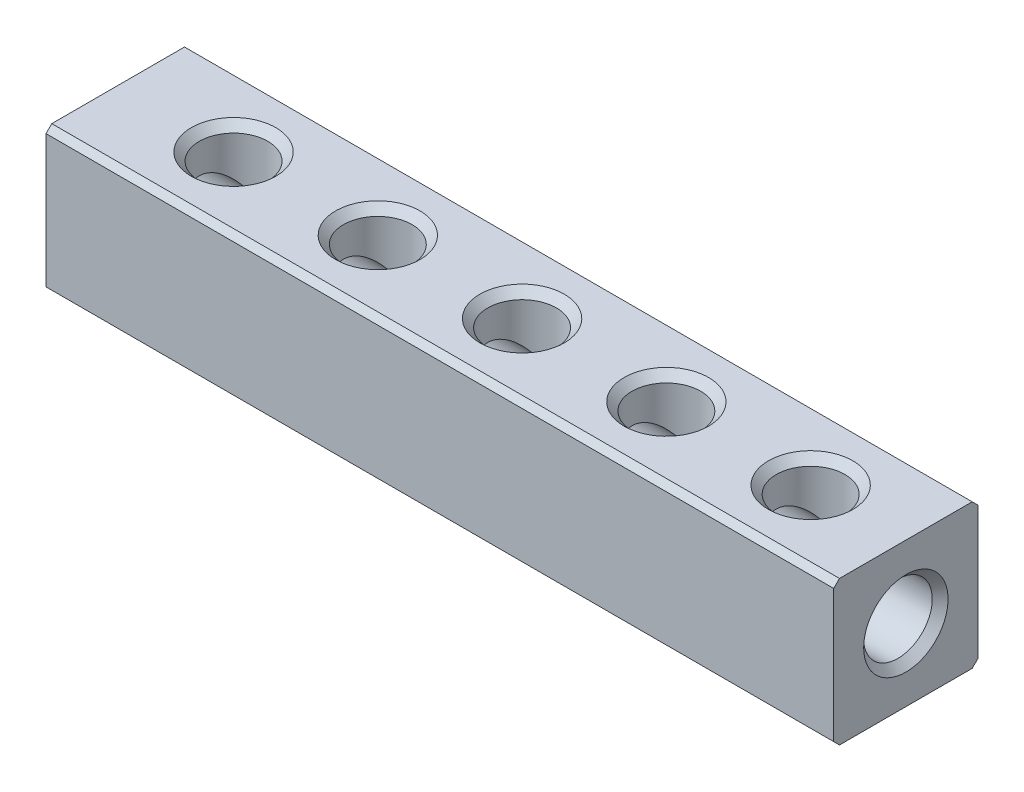
ISO-10303-21;
HEADER;
FILE_DESCRIPTION(('STEP AP214'),'2;1');
FILE_NAME('part.step','',(''),(''),'','','');
FILE_SCHEMA(('AUTOMOTIVE_DESIGN { 1 0 10303 214 1 1 1 1 }'));
ENDSEC;
DATA;
#1=APPLICATION_CONTEXT('core data for automotive mechanical design processes');
#2=APPLICATION_PROTOCOL_DEFINITION('international standard','automotive_design',2000,#1);
#3=PRODUCT_CONTEXT('',#1,'mechanical');
#4=PRODUCT('Part','Part','',(#3));
#5=PRODUCT_RELATED_PRODUCT_CATEGORY('part','',(#4));
#6=PRODUCT_DEFINITION_FORMATION('','',#4);
#7=PRODUCT_DEFINITION_CONTEXT('part definition',#1,'design');
#8=PRODUCT_DEFINITION('design','',#6,#7);
#9=PRODUCT_DEFINITION_SHAPE('','',#8);
#10=(LENGTH_UNIT() NAMED_UNIT(*) SI_UNIT(.MILLI.,.METRE.));
#11=(NAMED_UNIT(*) PLANE_ANGLE_UNIT() SI_UNIT($,.RADIAN.));
#12=(NAMED_UNIT(*) SI_UNIT($,.STERADIAN.) SOLID_ANGLE_UNIT());
#13=UNCERTAINTY_MEASURE_WITH_UNIT(LENGTH_MEASURE(1.E-05),#10,'distance_accuracy_value','');
#14=(GEOMETRIC_REPRESENTATION_CONTEXT(3) GLOBAL_UNCERTAINTY_ASSIGNED_CONTEXT((#13)) GLOBAL_UNIT_ASSIGNED_CONTEXT((#10,
#11,#12)) REPRESENTATION_CONTEXT('',''));
#15=CARTESIAN_POINT('',(0.,0.,0.));
#16=DIRECTION('',(0.,0.,1.));
#17=DIRECTION('',(1.,0.,0.));
#18=AXIS2_PLACEMENT_3D('',#15,#16,#17);
#19=CARTESIAN_POINT('',(0.,0.,25.));
#20=DIRECTION('',(0.,-1.,0.));
#21=DIRECTION('',(0.,0.,-1.));
#22=AXIS2_PLACEMENT_3D('',#19,#20,#21);
#23=PLANE('',#22);
#24=CARTESIAN_POINT('',(70.,0.,12.5));
#25=DIRECTION('',(0.,1.,0.));
#26=DIRECTION('',(0.,0.,1.));
#27=AXIS2_PLACEMENT_3D('',#24,#25,#26);
#28=CIRCLE('',#27,7.31519999999999);
#29=CARTESIAN_POINT('',(70.,0.,19.8152));
#30=VERTEX_POINT('',#29);
#31=EDGE_CURVE('E308',#30,#30,#28,.T.);
#32=ORIENTED_EDGE('',*,*,#31,.F.);
#33=EDGE_LOOP('',(#32));
#34=FACE_BOUND('',#33,.T.);
#35=DIRECTION('',(0.,0.,-1.));
#36=VECTOR('',#35,1.);
#37=CARTESIAN_POINT('',(136.5,0.,25.));
#38=LINE('',#37,#36);
#39=CARTESIAN_POINT('',(136.5,0.,24.));
#40=VERTEX_POINT('',#39);
#41=CARTESIAN_POINT('',(136.5,0.,1.));
#42=VERTEX_POINT('',#41);
#43=EDGE_CURVE('E248',#40,#42,#38,.T.);
#44=ORIENTED_EDGE('',*,*,#43,.T.);
#45=DIRECTION('',(-1.,0.,0.));
#46=VECTOR('',#45,1.);
#47=CARTESIAN_POINT('',(0.,0.,1.));
#48=LINE('',#47,#46);
#49=CARTESIAN_POINT('',(0.,0.,1.));
#50=VERTEX_POINT('',#49);
#51=EDGE_CURVE('E170',#42,#50,#48,.T.);
#52=ORIENTED_EDGE('',*,*,#51,.T.);
#53=DIRECTION('',(0.,0.,-1.));
#54=VECTOR('',#53,1.);
#55=CARTESIAN_POINT('',(0.,0.,25.));
#56=LINE('',#55,#54);
#57=CARTESIAN_POINT('',(0.,0.,24.));
#58=VERTEX_POINT('',#57);
#59=EDGE_CURVE('E234',#58,#50,#56,.T.);
#60=ORIENTED_EDGE('',*,*,#59,.F.);
#61=DIRECTION('',(1.,0.,0.));
#62=VECTOR('',#61,1.);
#63=CARTESIAN_POINT('',(136.5,0.,24.));
#64=LINE('',#63,#62);
#65=EDGE_CURVE('E167',#58,#40,#64,.T.);
#66=ORIENTED_EDGE('',*,*,#65,.T.);
#67=EDGE_LOOP('',(#44,#52,#60,#66));
#68=FACE_BOUND('',#67,.T.);
#69=CARTESIAN_POINT('',(20.,0.,12.5));
#70=DIRECTION('',(0.,1.,0.));
#71=DIRECTION('',(0.,0.,1.));
#72=AXIS2_PLACEMENT_3D('',#69,#70,#71);
#73=CIRCLE('',#72,7.3152);
#74=CARTESIAN_POINT('',(20.,0.,19.8152));
#75=VERTEX_POINT('',#74);
#76=EDGE_CURVE('E332',#75,#75,#73,.T.);
#77=ORIENTED_EDGE('',*,*,#76,.F.);
#78=EDGE_LOOP('',(#77));
#79=FACE_BOUND('',#78,.T.);
#80=CARTESIAN_POINT('',(45.,0.,12.5));
#81=DIRECTION('',(0.,1.,0.));
#82=DIRECTION('',(0.,0.,1.));
#83=AXIS2_PLACEMENT_3D('',#80,#81,#82);
#84=CIRCLE('',#83,7.3152);
#85=CARTESIAN_POINT('',(45.,0.,19.8152));
#86=VERTEX_POINT('',#85);
#87=EDGE_CURVE('E323',#86,#86,#84,.T.);
#88=ORIENTED_EDGE('',*,*,#87,.F.);
#89=EDGE_LOOP('',(#88));
#90=FACE_BOUND('',#89,.T.);
#91=CARTESIAN_POINT('',(95.,0.,12.5));
#92=DIRECTION('',(0.,1.,0.));
#93=DIRECTION('',(0.,0.,1.));
#94=AXIS2_PLACEMENT_3D('',#91,#92,#93);
#95=CIRCLE('',#94,7.31519999999999);
#96=CARTESIAN_POINT('',(95.,0.,19.8152));
#97=VERTEX_POINT('',#96);
#98=EDGE_CURVE('E309',#97,#97,#95,.T.);
#99=ORIENTED_EDGE('',*,*,#98,.F.);
#100=EDGE_LOOP('',(#99));
#101=FACE_BOUND('',#100,.T.);
#102=CARTESIAN_POINT('',(120.,0.,12.5));
#103=DIRECTION('',(0.,1.,0.));
#104=DIRECTION('',(0.,0.,1.));
#105=AXIS2_PLACEMENT_3D('',#102,#103,#104);
#106=CIRCLE('',#105,7.31520000000001);
#107=CARTESIAN_POINT('',(120.,0.,19.8152));
#108=VERTEX_POINT('',#107);
#109=EDGE_CURVE('E397',#108,#108,#106,.T.);
#110=ORIENTED_EDGE('',*,*,#109,.F.);
#111=EDGE_LOOP('',(#110));
#112=FACE_BOUND('',#111,.T.);
#113=ADVANCED_FACE('F51',(#34,#68,#79,#90,#101,#112),#23,.F.);
#114=CARTESIAN_POINT('',(0.,-25.,25.));
#115=DIRECTION('',(0.,1.,0.));
#116=DIRECTION('',(0.,0.,1.));
#117=AXIS2_PLACEMENT_3D('',#114,#115,#116);
#118=PLANE('',#117);
#119=DIRECTION('',(0.,0.,-1.));
#120=VECTOR('',#119,1.);
#121=CARTESIAN_POINT('',(0.,-25.,25.));
#122=LINE('',#121,#120);
#123=CARTESIAN_POINT('',(0.,-25.,24.));
#124=VERTEX_POINT('',#123);
#125=CARTESIAN_POINT('',(0.,-25.,0.999999999999973));
#126=VERTEX_POINT('',#125);
#127=EDGE_CURVE('E255',#124,#126,#122,.T.);
#128=ORIENTED_EDGE('',*,*,#127,.T.);
#129=DIRECTION('',(1.,0.,0.));
#130=VECTOR('',#129,1.);
#131=CARTESIAN_POINT('',(0.,-25.,0.999999999999973));
#132=LINE('',#131,#130);
#133=CARTESIAN_POINT('',(136.5,-25.,0.999999999999973));
#134=VERTEX_POINT('',#133);
#135=EDGE_CURVE('E208',#126,#134,#132,.T.);
#136=ORIENTED_EDGE('',*,*,#135,.T.);
#137=DIRECTION('',(0.,0.,-1.));
#138=VECTOR('',#137,1.);
#139=CARTESIAN_POINT('',(136.5,-25.,25.));
#140=LINE('',#139,#138);
#141=CARTESIAN_POINT('',(136.5,-25.,24.));
#142=VERTEX_POINT('',#141);
#143=EDGE_CURVE('E252',#142,#134,#140,.T.);
#144=ORIENTED_EDGE('',*,*,#143,.F.);
#145=DIRECTION('',(-1.,0.,0.));
#146=VECTOR('',#145,1.);
#147=CARTESIAN_POINT('',(0.,-25.,24.));
#148=LINE('',#147,#146);
#149=EDGE_CURVE('E205',#142,#124,#148,.T.);
#150=ORIENTED_EDGE('',*,*,#149,.T.);
#151=EDGE_LOOP('',(#128,#136,#144,#150));
#152=FACE_BOUND('',#151,.T.);
#153=CARTESIAN_POINT('',(68.25,-25.,12.5));
#154=DIRECTION('',(0.,-1.,0.));
#155=DIRECTION('',(0.,0.,-1.));
#156=AXIS2_PLACEMENT_3D('',#153,#154,#155);
#157=CIRCLE('',#156,7.31519999999999);
#158=CARTESIAN_POINT('',(68.25,-25.,5.18480000000001));
#159=VERTEX_POINT('',#158);
#160=EDGE_CURVE('E340',#159,#159,#157,.T.);
#161=ORIENTED_EDGE('',*,*,#160,.F.);
#162=EDGE_LOOP('',(#161));
#163=FACE_BOUND('',#162,.T.);
#164=ADVANCED_FACE('F390',(#152,#163),#118,.F.);
#165=CARTESIAN_POINT('',(0.,0.,25.));
#166=DIRECTION('',(1.,0.,0.));
#167=DIRECTION('',(0.,1.,0.));
#168=AXIS2_PLACEMENT_3D('',#165,#166,#167);
#169=PLANE('',#168);
#170=CARTESIAN_POINT('',(0.,-12.5,12.5));
#171=DIRECTION('',(-1.,0.,0.));
#172=DIRECTION('',(0.,0.,1.));
#173=AXIS2_PLACEMENT_3D('',#170,#171,#172);
#174=CIRCLE('',#173,7.3152);
#175=CARTESIAN_POINT('',(0.,-12.5,19.8152));
#176=VERTEX_POINT('',#175);
#177=EDGE_CURVE('E352',#176,#176,#174,.T.);
#178=ORIENTED_EDGE('',*,*,#177,.F.);
#179=EDGE_LOOP('',(#178));
#180=FACE_BOUND('',#179,.T.);
#181=ORIENTED_EDGE('',*,*,#59,.T.);
#182=DIRECTION('',(0.,0.707106781186548,0.707106781186548));
#183=VECTOR('',#182,1.);
#184=CARTESIAN_POINT('',(0.,0.,1.));
#185=LINE('',#184,#183);
#186=CARTESIAN_POINT('',(0.,-1.,0.));
#187=VERTEX_POINT('',#186);
#188=EDGE_CURVE('E186',#50,#187,#185,.F.);
#189=ORIENTED_EDGE('',*,*,#188,.T.);
#190=DIRECTION('',(0.,-1.,0.));
#191=VECTOR('',#190,1.);
#192=CARTESIAN_POINT('',(0.,0.,0.));
#193=LINE('',#192,#191);
#194=CARTESIAN_POINT('',(0.,-24.,0.));
#195=VERTEX_POINT('',#194);
#196=EDGE_CURVE('E237',#187,#195,#193,.T.);
#197=ORIENTED_EDGE('',*,*,#196,.T.);
#198=DIRECTION('',(0.,0.707106781186552,-0.707106781186543));
#199=VECTOR('',#198,1.);
#200=CARTESIAN_POINT('',(0.,-25.,0.999999999999973));
#201=LINE('',#200,#199);
#202=EDGE_CURVE('E183',#195,#126,#201,.F.);
#203=ORIENTED_EDGE('',*,*,#202,.T.);
#204=ORIENTED_EDGE('',*,*,#127,.F.);
#205=DIRECTION('',(0.,0.707106781186543,0.707106781186552));
#206=VECTOR('',#205,1.);
#207=CARTESIAN_POINT('',(0.,-24.,25.));
#208=LINE('',#207,#206);
#209=CARTESIAN_POINT('',(0.,-24.,25.));
#210=VERTEX_POINT('',#209);
#211=EDGE_CURVE('E180',#124,#210,#208,.T.);
#212=ORIENTED_EDGE('',*,*,#211,.T.);
#213=DIRECTION('',(0.,-1.,0.));
#214=VECTOR('',#213,1.);
#215=CARTESIAN_POINT('',(0.,0.,25.));
#216=LINE('',#215,#214);
#217=CARTESIAN_POINT('',(0.,-0.999999999999973,25.));
#218=VERTEX_POINT('',#217);
#219=EDGE_CURVE('E218',#218,#210,#216,.T.);
#220=ORIENTED_EDGE('',*,*,#219,.F.);
#221=DIRECTION('',(0.,0.707106781186543,-0.707106781186552));
#222=VECTOR('',#221,1.);
#223=CARTESIAN_POINT('',(0.,-0.999999999999973,25.));
#224=LINE('',#223,#222);
#225=EDGE_CURVE('E177',#218,#58,#224,.T.);
#226=ORIENTED_EDGE('',*,*,#225,.T.);
#227=EDGE_LOOP('',(#181,#189,#197,#203,#204,#212,#220,#226));
#228=FACE_BOUND('',#227,.T.);
#229=ADVANCED_FACE('F225',(#180,#228),#169,.F.);
#230=CARTESIAN_POINT('',(136.5,0.,25.));
#231=DIRECTION('',(-1.,0.,0.));
#232=DIRECTION('',(0.,0.,1.));
#233=AXIS2_PLACEMENT_3D('',#230,#231,#232);
#234=PLANE('',#233);
#235=CARTESIAN_POINT('',(136.5,-12.5,12.5));
#236=DIRECTION('',(-1.,0.,0.));
#237=DIRECTION('',(0.,0.,1.));
#238=AXIS2_PLACEMENT_3D('',#235,#236,#237);
#239=CIRCLE('',#238,7.31519999999997);
#240=CARTESIAN_POINT('',(136.5,-12.5,19.8152));
#241=VERTEX_POINT('',#240);
#242=EDGE_CURVE('E348',#241,#241,#239,.T.);
#243=ORIENTED_EDGE('',*,*,#242,.T.);
#244=EDGE_LOOP('',(#243));
#245=FACE_BOUND('',#244,.T.);
#246=DIRECTION('',(0.,1.,0.));
#247=VECTOR('',#246,1.);
#248=CARTESIAN_POINT('',(136.5,0.,0.));
#249=LINE('',#248,#247);
#250=CARTESIAN_POINT('',(136.5,-24.,0.));
#251=VERTEX_POINT('',#250);
#252=CARTESIAN_POINT('',(136.5,-1.,0.));
#253=VERTEX_POINT('',#252);
#254=EDGE_CURVE('E230',#251,#253,#249,.T.);
#255=ORIENTED_EDGE('',*,*,#254,.T.);
#256=DIRECTION('',(0.,-0.707106781186548,-0.707106781186548));
#257=VECTOR('',#256,1.);
#258=CARTESIAN_POINT('',(136.5,0.,1.));
#259=LINE('',#258,#257);
#260=EDGE_CURVE('E202',#253,#42,#259,.F.);
#261=ORIENTED_EDGE('',*,*,#260,.T.);
#262=ORIENTED_EDGE('',*,*,#43,.F.);
#263=DIRECTION('',(0.,-0.707106781186543,0.707106781186552));
#264=VECTOR('',#263,1.);
#265=CARTESIAN_POINT('',(136.5,-0.999999999999973,25.));
#266=LINE('',#265,#264);
#267=CARTESIAN_POINT('',(136.5,-0.999999999999973,25.));
#268=VERTEX_POINT('',#267);
#269=EDGE_CURVE('E195',#40,#268,#266,.T.);
#270=ORIENTED_EDGE('',*,*,#269,.T.);
#271=DIRECTION('',(0.,1.,0.));
#272=VECTOR('',#271,1.);
#273=CARTESIAN_POINT('',(136.5,0.,25.));
#274=LINE('',#273,#272);
#275=CARTESIAN_POINT('',(136.5,-24.,25.));
#276=VERTEX_POINT('',#275);
#277=EDGE_CURVE('E220',#276,#268,#274,.T.);
#278=ORIENTED_EDGE('',*,*,#277,.F.);
#279=DIRECTION('',(0.,-0.707106781186543,-0.707106781186552));
#280=VECTOR('',#279,1.);
#281=CARTESIAN_POINT('',(136.5,-24.,25.));
#282=LINE('',#281,#280);
#283=EDGE_CURVE('E76',#276,#142,#282,.T.);
#284=ORIENTED_EDGE('',*,*,#283,.T.);
#285=ORIENTED_EDGE('',*,*,#143,.T.);
#286=DIRECTION('',(0.,-0.707106781186552,0.707106781186543));
#287=VECTOR('',#286,1.);
#288=CARTESIAN_POINT('',(136.5,-25.,0.999999999999973));
#289=LINE('',#288,#287);
#290=EDGE_CURVE('E68',#134,#251,#289,.F.);
#291=ORIENTED_EDGE('',*,*,#290,.T.);
#292=EDGE_LOOP('',(#255,#261,#262,#270,#278,#284,#285,#291));
#293=FACE_BOUND('',#292,.T.);
#294=ADVANCED_FACE('F451',(#245,#293),#234,.F.);
#295=CARTESIAN_POINT('',(0.,0.,25.));
#296=DIRECTION('',(0.,0.,1.));
#297=DIRECTION('',(1.,0.,0.));
#298=AXIS2_PLACEMENT_3D('',#295,#296,#297);
#299=PLANE('',#298);
#300=ORIENTED_EDGE('',*,*,#219,.T.);
#301=DIRECTION('',(1.,0.,0.));
#302=VECTOR('',#301,1.);
#303=CARTESIAN_POINT('',(136.5,-24.,25.));
#304=LINE('',#303,#302);
#305=EDGE_CURVE('E11',#210,#276,#304,.T.);
#306=ORIENTED_EDGE('',*,*,#305,.T.);
#307=ORIENTED_EDGE('',*,*,#277,.T.);
#308=DIRECTION('',(-1.,0.,0.));
#309=VECTOR('',#308,1.);
#310=CARTESIAN_POINT('',(0.,-0.999999999999973,25.));
#311=LINE('',#310,#309);
#312=EDGE_CURVE('E61',#268,#218,#311,.T.);
#313=ORIENTED_EDGE('',*,*,#312,.T.);
#314=EDGE_LOOP('',(#300,#306,#307,#313));
#315=FACE_BOUND('',#314,.T.);
#316=ADVANCED_FACE('F217',(#315),#299,.T.);
#317=CARTESIAN_POINT('',(0.,0.,0.));
#318=DIRECTION('',(0.,0.,1.));
#319=DIRECTION('',(1.,0.,0.));
#320=AXIS2_PLACEMENT_3D('',#317,#318,#319);
#321=PLANE('',#320);
#322=ORIENTED_EDGE('',*,*,#196,.F.);
#323=DIRECTION('',(1.,0.,0.));
#324=VECTOR('',#323,1.);
#325=CARTESIAN_POINT('',(0.,-1.,0.));
#326=LINE('',#325,#324);
#327=EDGE_CURVE('E192',#187,#253,#326,.T.);
#328=ORIENTED_EDGE('',*,*,#327,.T.);
#329=ORIENTED_EDGE('',*,*,#254,.F.);
#330=DIRECTION('',(-1.,0.,0.));
#331=VECTOR('',#330,1.);
#332=CARTESIAN_POINT('',(0.,-24.,0.));
#333=LINE('',#332,#331);
#334=EDGE_CURVE('E189',#251,#195,#333,.T.);
#335=ORIENTED_EDGE('',*,*,#334,.T.);
#336=EDGE_LOOP('',(#322,#328,#329,#335));
#337=FACE_BOUND('',#336,.T.);
#338=ADVANCED_FACE('F447',(#337),#321,.F.);
#339=CARTESIAN_POINT('',(135.1284,-12.5,12.5));
#340=DIRECTION('',(1.,0.,0.));
#341=DIRECTION('',(0.,0.,-1.));
#342=AXIS2_PLACEMENT_3D('',#339,#340,#341);
#343=CONICAL_SURFACE('',#342,5.94359999999998,0.785398163397433);
#344=ORIENTED_EDGE('',*,*,#242,.F.);
#345=EDGE_LOOP('',(#344));
#346=FACE_BOUND('',#345,.T.);
#347=CARTESIAN_POINT('',(135.1284,-12.5,12.5));
#348=DIRECTION('',(-1.,0.,0.));
#349=DIRECTION('',(0.,0.,1.));
#350=AXIS2_PLACEMENT_3D('',#347,#348,#349);
#351=CIRCLE('',#350,5.94359999999998);
#352=CARTESIAN_POINT('',(135.1284,-12.5,18.4436));
#353=VERTEX_POINT('',#352);
#354=EDGE_CURVE('E240',#353,#353,#351,.T.);
#355=ORIENTED_EDGE('',*,*,#354,.T.);
#356=EDGE_LOOP('',(#355));
#357=FACE_BOUND('',#356,.T.);
#358=ADVANCED_FACE('F364',(#346,#357),#343,.F.);
#359=CARTESIAN_POINT('',(0.,-12.5,12.5));
#360=DIRECTION('',(-1.,0.,0.));
#361=DIRECTION('',(0.,0.,1.));
#362=AXIS2_PLACEMENT_3D('',#359,#360,#361);
#363=CYLINDRICAL_SURFACE('',#362,5.94359999999999);
#364=CARTESIAN_POINT('',(120.,-12.5,12.5));
#365=DIRECTION('',(-0.707106781186547,-0.707106781186547,0.));
#366=DIRECTION('',(-0.707106781186547,0.707106781186547,0.));
#367=AXIS2_PLACEMENT_3D('',#364,#365,#366);
#368=ELLIPSE('',#367,8.40551972932071,5.94359999999999);
#369=CARTESIAN_POINT('',(120.,-12.5,6.5564));
#370=VERTEX_POINT('',#369);
#371=CARTESIAN_POINT('',(120.,-12.5,18.4436));
#372=VERTEX_POINT('',#371);
#373=EDGE_CURVE('E155',#370,#372,#368,.F.);
#374=ORIENTED_EDGE('',*,*,#373,.T.);
#375=CARTESIAN_POINT('',(120.,-12.5,12.5));
#376=DIRECTION('',(-0.707106781186547,0.707106781186547,0.));
#377=DIRECTION('',(-0.707106781186547,-0.707106781186547,0.));
#378=AXIS2_PLACEMENT_3D('',#375,#376,#377);
#379=ELLIPSE('',#378,8.40551972932071,5.94359999999999);
#380=EDGE_CURVE('E159',#372,#370,#379,.T.);
#381=ORIENTED_EDGE('',*,*,#380,.T.);
#382=EDGE_LOOP('',(#374,#381));
#383=FACE_BOUND('',#382,.T.);
#384=CARTESIAN_POINT('',(95.,-12.5,12.5));
#385=DIRECTION('',(-0.707106781186547,-0.707106781186547,0.));
#386=DIRECTION('',(-0.707106781186547,0.707106781186547,0.));
#387=AXIS2_PLACEMENT_3D('',#384,#385,#386);
#388=ELLIPSE('',#387,8.40551972932071,5.94359999999999);
#389=CARTESIAN_POINT('',(95.,-12.5,6.55640000000001));
#390=VERTEX_POINT('',#389);
#391=CARTESIAN_POINT('',(95.,-12.5,18.4436));
#392=VERTEX_POINT('',#391);
#393=EDGE_CURVE('E290',#390,#392,#388,.F.);
#394=ORIENTED_EDGE('',*,*,#393,.T.);
#395=CARTESIAN_POINT('',(95.,-12.5,12.5));
#396=DIRECTION('',(-0.707106781186547,0.707106781186547,0.));
#397=DIRECTION('',(-0.707106781186547,-0.707106781186547,0.));
#398=AXIS2_PLACEMENT_3D('',#395,#396,#397);
#399=ELLIPSE('',#398,8.40551972932071,5.94359999999999);
#400=EDGE_CURVE('E162',#392,#390,#399,.T.);
#401=ORIENTED_EDGE('',*,*,#400,.T.);
#402=EDGE_LOOP('',(#394,#401));
#403=FACE_BOUND('',#402,.T.);
#404=CARTESIAN_POINT('',(70.,-12.5,12.5));
#405=DIRECTION('',(-0.707106781186547,0.707106781186547,0.));
#406=DIRECTION('',(-0.707106781186547,-0.707106781186547,0.));
#407=AXIS2_PLACEMENT_3D('',#404,#405,#406);
#408=ELLIPSE('',#407,8.40551972932071,5.94359999999999);
#409=CARTESIAN_POINT('',(70.,-12.5,18.4436));
#410=VERTEX_POINT('',#409);
#411=CARTESIAN_POINT('',(70.,-12.5,6.55640000000001));
#412=VERTEX_POINT('',#411);
#413=EDGE_CURVE('E286',#410,#412,#408,.T.);
#414=ORIENTED_EDGE('',*,*,#413,.T.);
#415=CARTESIAN_POINT('',(70.,-12.5,12.5));
#416=DIRECTION('',(-0.707106781186547,-0.707106781186547,0.));
#417=DIRECTION('',(-0.707106781186547,0.707106781186547,0.));
#418=AXIS2_PLACEMENT_3D('',#415,#416,#417);
#419=ELLIPSE('',#418,8.40551972932071,5.94359999999999);
#420=EDGE_CURVE('E282',#412,#410,#419,.F.);
#421=ORIENTED_EDGE('',*,*,#420,.T.);
#422=EDGE_LOOP('',(#414,#421));
#423=FACE_BOUND('',#422,.T.);
#424=ORIENTED_EDGE('',*,*,#354,.F.);
#425=EDGE_LOOP('',(#424));
#426=FACE_BOUND('',#425,.T.);
#427=CARTESIAN_POINT('',(1.37160000000001,-12.5,12.5));
#428=DIRECTION('',(-1.,0.,0.));
#429=DIRECTION('',(0.,0.,1.));
#430=AXIS2_PLACEMENT_3D('',#427,#428,#429);
#431=CIRCLE('',#430,5.9436);
#432=CARTESIAN_POINT('',(1.37160000000001,-12.5,18.4436));
#433=VERTEX_POINT('',#432);
#434=EDGE_CURVE('E355',#433,#433,#431,.T.);
#435=ORIENTED_EDGE('',*,*,#434,.T.);
#436=EDGE_LOOP('',(#435));
#437=FACE_BOUND('',#436,.T.);
#438=CARTESIAN_POINT('',(68.25,-12.5,12.5));
#439=DIRECTION('',(-0.707106781186547,-0.707106781186547,0.));
#440=DIRECTION('',(-0.707106781186547,0.707106781186547,0.));
#441=AXIS2_PLACEMENT_3D('',#438,#439,#440);
#442=ELLIPSE('',#441,8.40551972932071,5.94359999999999);
#443=CARTESIAN_POINT('',(68.25,-12.5,6.55640000000001));
#444=VERTEX_POINT('',#443);
#445=CARTESIAN_POINT('',(68.25,-12.5,18.4436));
#446=VERTEX_POINT('',#445);
#447=EDGE_CURVE('E263',#444,#446,#442,.T.);
#448=ORIENTED_EDGE('',*,*,#447,.T.);
#449=CARTESIAN_POINT('',(68.25,-12.5,12.5));
#450=DIRECTION('',(-0.707106781186547,0.707106781186547,0.));
#451=DIRECTION('',(-0.707106781186547,-0.707106781186547,0.));
#452=AXIS2_PLACEMENT_3D('',#449,#450,#451);
#453=ELLIPSE('',#452,8.40551972932071,5.94359999999999);
#454=EDGE_CURVE('E259',#446,#444,#453,.F.);
#455=ORIENTED_EDGE('',*,*,#454,.T.);
#456=EDGE_LOOP('',(#448,#455));
#457=FACE_BOUND('',#456,.T.);
#458=CARTESIAN_POINT('',(20.,-12.5,12.5));
#459=DIRECTION('',(-0.707106781186547,-0.707106781186547,0.));
#460=DIRECTION('',(-0.707106781186547,0.707106781186547,0.));
#461=AXIS2_PLACEMENT_3D('',#458,#459,#460);
#462=ELLIPSE('',#461,8.40551972932071,5.94359999999999);
#463=CARTESIAN_POINT('',(20.,-12.5,6.55640000000001));
#464=VERTEX_POINT('',#463);
#465=CARTESIAN_POINT('',(20.,-12.5,18.4436));
#466=VERTEX_POINT('',#465);
#467=EDGE_CURVE('E266',#464,#466,#462,.F.);
#468=ORIENTED_EDGE('',*,*,#467,.T.);
#469=CARTESIAN_POINT('',(20.,-12.5,12.5));
#470=DIRECTION('',(-0.707106781186547,0.707106781186547,0.));
#471=DIRECTION('',(-0.707106781186547,-0.707106781186547,0.));
#472=AXIS2_PLACEMENT_3D('',#469,#470,#471);
#473=ELLIPSE('',#472,8.40551972932071,5.94359999999999);
#474=EDGE_CURVE('E270',#466,#464,#473,.T.);
#475=ORIENTED_EDGE('',*,*,#474,.T.);
#476=EDGE_LOOP('',(#468,#475));
#477=FACE_BOUND('',#476,.T.);
#478=CARTESIAN_POINT('',(45.,-12.5,12.5));
#479=DIRECTION('',(-0.707106781186547,-0.707106781186547,0.));
#480=DIRECTION('',(-0.707106781186547,0.707106781186547,0.));
#481=AXIS2_PLACEMENT_3D('',#478,#479,#480);
#482=ELLIPSE('',#481,8.40551972932071,5.94359999999999);
#483=CARTESIAN_POINT('',(45.,-12.5,6.55640000000001));
#484=VERTEX_POINT('',#483);
#485=CARTESIAN_POINT('',(45.,-12.5,18.4436));
#486=VERTEX_POINT('',#485);
#487=EDGE_CURVE('E274',#484,#486,#482,.F.);
#488=ORIENTED_EDGE('',*,*,#487,.T.);
#489=CARTESIAN_POINT('',(45.,-12.5,12.5));
#490=DIRECTION('',(-0.707106781186547,0.707106781186547,0.));
#491=DIRECTION('',(-0.707106781186547,-0.707106781186547,0.));
#492=AXIS2_PLACEMENT_3D('',#489,#490,#491);
#493=ELLIPSE('',#492,8.40551972932071,5.94359999999999);
#494=EDGE_CURVE('E278',#486,#484,#493,.T.);
#495=ORIENTED_EDGE('',*,*,#494,.T.);
#496=EDGE_LOOP('',(#488,#495));
#497=FACE_BOUND('',#496,.T.);
#498=ADVANCED_FACE('F164',(#383,#403,#423,#426,#437,#457,#477,#497),#363,.F.);
#499=CARTESIAN_POINT('',(0.,-12.5,12.5));
#500=DIRECTION('',(-1.,0.,0.));
#501=DIRECTION('',(0.,0.,1.));
#502=AXIS2_PLACEMENT_3D('',#499,#500,#501);
#503=CONICAL_SURFACE('',#502,7.3152,0.785398163397446);
#504=ORIENTED_EDGE('',*,*,#434,.F.);
#505=EDGE_LOOP('',(#504));
#506=FACE_BOUND('',#505,.T.);
#507=ORIENTED_EDGE('',*,*,#177,.T.);
#508=EDGE_LOOP('',(#507));
#509=FACE_BOUND('',#508,.T.);
#510=ADVANCED_FACE('F367',(#506,#509),#503,.F.);
#511=CARTESIAN_POINT('',(68.25,-25.,12.5));
#512=DIRECTION('',(0.,-1.,0.));
#513=DIRECTION('',(0.,0.,-1.));
#514=AXIS2_PLACEMENT_3D('',#511,#512,#513);
#515=CYLINDRICAL_SURFACE('',#514,5.94359999999999);
#516=ORIENTED_EDGE('',*,*,#454,.F.);
#517=ORIENTED_EDGE('',*,*,#447,.F.);
#518=EDGE_LOOP('',(#516,#517));
#519=FACE_BOUND('',#518,.T.);
#520=CARTESIAN_POINT('',(68.25,-23.6284,12.5));
#521=DIRECTION('',(0.,-1.,0.));
#522=DIRECTION('',(0.,0.,-1.));
#523=AXIS2_PLACEMENT_3D('',#520,#521,#522);
#524=CIRCLE('',#523,5.94359999999999);
#525=CARTESIAN_POINT('',(68.25,-23.6284,6.55640000000001));
#526=VERTEX_POINT('',#525);
#527=EDGE_CURVE('E344',#526,#526,#524,.T.);
#528=ORIENTED_EDGE('',*,*,#527,.T.);
#529=EDGE_LOOP('',(#528));
#530=FACE_BOUND('',#529,.T.);
#531=ADVANCED_FACE('F437',(#519,#530),#515,.F.);
#532=CARTESIAN_POINT('',(68.25,-25.,12.5));
#533=DIRECTION('',(0.,-1.,0.));
#534=DIRECTION('',(0.,0.,-1.));
#535=AXIS2_PLACEMENT_3D('',#532,#533,#534);
#536=CONICAL_SURFACE('',#535,7.31519999999999,0.785398163397448);
#537=ORIENTED_EDGE('',*,*,#527,.F.);
#538=EDGE_LOOP('',(#537));
#539=FACE_BOUND('',#538,.T.);
#540=ORIENTED_EDGE('',*,*,#160,.T.);
#541=EDGE_LOOP('',(#540));
#542=FACE_BOUND('',#541,.T.);
#543=ADVANCED_FACE('F433',(#539,#542),#536,.F.);
#544=CARTESIAN_POINT('',(20.,0.,12.5));
#545=DIRECTION('',(0.,1.,0.));
#546=DIRECTION('',(0.,0.,1.));
#547=AXIS2_PLACEMENT_3D('',#544,#545,#546);
#548=CYLINDRICAL_SURFACE('',#547,5.94359999999999);
#549=ORIENTED_EDGE('',*,*,#467,.F.);
#550=ORIENTED_EDGE('',*,*,#474,.F.);
#551=EDGE_LOOP('',(#549,#550));
#552=FACE_BOUND('',#551,.T.);
#553=CARTESIAN_POINT('',(20.,-1.3716,12.5));
#554=DIRECTION('',(0.,1.,0.));
#555=DIRECTION('',(0.,0.,1.));
#556=AXIS2_PLACEMENT_3D('',#553,#554,#555);
#557=CIRCLE('',#556,5.94359999999999);
#558=CARTESIAN_POINT('',(20.,-1.3716,18.4436));
#559=VERTEX_POINT('',#558);
#560=EDGE_CURVE('E336',#559,#559,#557,.T.);
#561=ORIENTED_EDGE('',*,*,#560,.T.);
#562=EDGE_LOOP('',(#561));
#563=FACE_BOUND('',#562,.T.);
#564=ADVANCED_FACE('F429',(#552,#563),#548,.F.);
#565=CARTESIAN_POINT('',(20.,0.,12.5));
#566=DIRECTION('',(0.,1.,0.));
#567=DIRECTION('',(0.,0.,1.));
#568=AXIS2_PLACEMENT_3D('',#565,#566,#567);
#569=CONICAL_SURFACE('',#568,7.3152,0.78539816339745);
#570=ORIENTED_EDGE('',*,*,#560,.F.);
#571=EDGE_LOOP('',(#570));
#572=FACE_BOUND('',#571,.T.);
#573=ORIENTED_EDGE('',*,*,#76,.T.);
#574=EDGE_LOOP('',(#573));
#575=FACE_BOUND('',#574,.T.);
#576=ADVANCED_FACE('F378',(#572,#575),#569,.F.);
#577=CARTESIAN_POINT('',(45.,0.,12.5));
#578=DIRECTION('',(0.,1.,0.));
#579=DIRECTION('',(0.,0.,1.));
#580=AXIS2_PLACEMENT_3D('',#577,#578,#579);
#581=CYLINDRICAL_SURFACE('',#580,5.94359999999999);
#582=ORIENTED_EDGE('',*,*,#487,.F.);
#583=ORIENTED_EDGE('',*,*,#494,.F.);
#584=EDGE_LOOP('',(#582,#583));
#585=FACE_BOUND('',#584,.T.);
#586=CARTESIAN_POINT('',(45.,-1.3716,12.5));
#587=DIRECTION('',(0.,1.,0.));
#588=DIRECTION('',(0.,0.,1.));
#589=AXIS2_PLACEMENT_3D('',#586,#587,#588);
#590=CIRCLE('',#589,5.94359999999999);
#591=CARTESIAN_POINT('',(45.,-1.3716,18.4436));
#592=VERTEX_POINT('',#591);
#593=EDGE_CURVE('E328',#592,#592,#590,.T.);
#594=ORIENTED_EDGE('',*,*,#593,.T.);
#595=EDGE_LOOP('',(#594));
#596=FACE_BOUND('',#595,.T.);
#597=ADVANCED_FACE('F374',(#585,#596),#581,.F.);
#598=CARTESIAN_POINT('',(45.,0.,12.5));
#599=DIRECTION('',(0.,1.,0.));
#600=DIRECTION('',(0.,0.,1.));
#601=AXIS2_PLACEMENT_3D('',#598,#599,#600);
#602=CONICAL_SURFACE('',#601,7.3152,0.785398163397453);
#603=ORIENTED_EDGE('',*,*,#593,.F.);
#604=EDGE_LOOP('',(#603));
#605=FACE_BOUND('',#604,.T.);
#606=ORIENTED_EDGE('',*,*,#87,.T.);
#607=EDGE_LOOP('',(#606));
#608=FACE_BOUND('',#607,.T.);
#609=ADVANCED_FACE('F377',(#605,#608),#602,.F.);
#610=CARTESIAN_POINT('',(70.,0.,12.5));
#611=DIRECTION('',(0.,1.,0.));
#612=DIRECTION('',(0.,0.,1.));
#613=AXIS2_PLACEMENT_3D('',#610,#611,#612);
#614=CYLINDRICAL_SURFACE('',#613,5.94359999999999);
#615=CARTESIAN_POINT('',(70.,-1.3716,12.5));
#616=DIRECTION('',(0.,1.,0.));
#617=DIRECTION('',(0.,0.,1.));
#618=AXIS2_PLACEMENT_3D('',#615,#616,#617);
#619=CIRCLE('',#618,5.94359999999999);
#620=CARTESIAN_POINT('',(70.,-1.3716,18.4436));
#621=VERTEX_POINT('',#620);
#622=EDGE_CURVE('E314',#621,#621,#619,.T.);
#623=ORIENTED_EDGE('',*,*,#622,.T.);
#624=EDGE_LOOP('',(#623));
#625=FACE_BOUND('',#624,.T.);
#626=ORIENTED_EDGE('',*,*,#420,.F.);
#627=ORIENTED_EDGE('',*,*,#413,.F.);
#628=EDGE_LOOP('',(#626,#627));
#629=FACE_BOUND('',#628,.T.);
#630=ADVANCED_FACE('F384',(#625,#629),#614,.F.);
#631=CARTESIAN_POINT('',(70.,0.,12.5));
#632=DIRECTION('',(0.,1.,0.));
#633=DIRECTION('',(0.,0.,1.));
#634=AXIS2_PLACEMENT_3D('',#631,#632,#633);
#635=CONICAL_SURFACE('',#634,7.31519999999999,0.785398163397448);
#636=ORIENTED_EDGE('',*,*,#622,.F.);
#637=EDGE_LOOP('',(#636));
#638=FACE_BOUND('',#637,.T.);
#639=ORIENTED_EDGE('',*,*,#31,.T.);
#640=EDGE_LOOP('',(#639));
#641=FACE_BOUND('',#640,.T.);
#642=ADVANCED_FACE('F301',(#638,#641),#635,.F.);
#643=CARTESIAN_POINT('',(95.,0.,12.5));
#644=DIRECTION('',(0.,1.,0.));
#645=DIRECTION('',(0.,0.,1.));
#646=AXIS2_PLACEMENT_3D('',#643,#644,#645);
#647=CYLINDRICAL_SURFACE('',#646,5.94359999999999);
#648=ORIENTED_EDGE('',*,*,#393,.F.);
#649=ORIENTED_EDGE('',*,*,#400,.F.);
#650=EDGE_LOOP('',(#648,#649));
#651=FACE_BOUND('',#650,.T.);
#652=CARTESIAN_POINT('',(95.,-1.3716,12.5));
#653=DIRECTION('',(0.,1.,0.));
#654=DIRECTION('',(0.,0.,1.));
#655=AXIS2_PLACEMENT_3D('',#652,#653,#654);
#656=CIRCLE('',#655,5.94359999999999);
#657=CARTESIAN_POINT('',(95.,-1.3716,18.4436));
#658=VERTEX_POINT('',#657);
#659=EDGE_CURVE('E305',#658,#658,#656,.T.);
#660=ORIENTED_EDGE('',*,*,#659,.T.);
#661=EDGE_LOOP('',(#660));
#662=FACE_BOUND('',#661,.T.);
#663=ADVANCED_FACE('F297',(#651,#662),#647,.F.);
#664=CARTESIAN_POINT('',(95.,0.,12.5));
#665=DIRECTION('',(0.,1.,0.));
#666=DIRECTION('',(0.,0.,1.));
#667=AXIS2_PLACEMENT_3D('',#664,#665,#666);
#668=CONICAL_SURFACE('',#667,7.31519999999999,0.785398163397448);
#669=ORIENTED_EDGE('',*,*,#659,.F.);
#670=EDGE_LOOP('',(#669));
#671=FACE_BOUND('',#670,.T.);
#672=ORIENTED_EDGE('',*,*,#98,.T.);
#673=EDGE_LOOP('',(#672));
#674=FACE_BOUND('',#673,.T.);
#675=ADVANCED_FACE('F300',(#671,#674),#668,.F.);
#676=CARTESIAN_POINT('',(120.,0.,12.5));
#677=DIRECTION('',(0.,1.,0.));
#678=DIRECTION('',(0.,0.,1.));
#679=AXIS2_PLACEMENT_3D('',#676,#677,#678);
#680=CYLINDRICAL_SURFACE('',#679,5.94359999999999);
#681=ORIENTED_EDGE('',*,*,#373,.F.);
#682=ORIENTED_EDGE('',*,*,#380,.F.);
#683=EDGE_LOOP('',(#681,#682));
#684=FACE_BOUND('',#683,.T.);
#685=CARTESIAN_POINT('',(120.,-1.3716,12.5));
#686=DIRECTION('',(0.,1.,0.));
#687=DIRECTION('',(0.,0.,1.));
#688=AXIS2_PLACEMENT_3D('',#685,#686,#687);
#689=CIRCLE('',#688,5.94359999999998);
#690=CARTESIAN_POINT('',(120.,-1.3716,18.4436));
#691=VERTEX_POINT('',#690);
#692=EDGE_CURVE('E317',#691,#691,#689,.T.);
#693=ORIENTED_EDGE('',*,*,#692,.T.);
#694=EDGE_LOOP('',(#693));
#695=FACE_BOUND('',#694,.T.);
#696=ADVANCED_FACE('F157',(#684,#695),#680,.F.);
#697=CARTESIAN_POINT('',(120.,0.,12.5));
#698=DIRECTION('',(0.,1.,0.));
#699=DIRECTION('',(0.,0.,1.));
#700=AXIS2_PLACEMENT_3D('',#697,#698,#699);
#701=CONICAL_SURFACE('',#700,7.31520000000001,0.785398163397458);
#702=ORIENTED_EDGE('',*,*,#692,.F.);
#703=EDGE_LOOP('',(#702));
#704=FACE_BOUND('',#703,.T.);
#705=ORIENTED_EDGE('',*,*,#109,.T.);
#706=EDGE_LOOP('',(#705));
#707=FACE_BOUND('',#706,.T.);
#708=ADVANCED_FACE('F405',(#704,#707),#701,.F.);
#709=CARTESIAN_POINT('',(0.,0.,1.));
#710=DIRECTION('',(0.,-0.707106781186547,0.707106781186547));
#711=DIRECTION('',(-1.,0.,0.));
#712=AXIS2_PLACEMENT_3D('',#709,#710,#711);
#713=PLANE('',#712);
#714=ORIENTED_EDGE('',*,*,#260,.F.);
#715=ORIENTED_EDGE('',*,*,#327,.F.);
#716=ORIENTED_EDGE('',*,*,#188,.F.);
#717=ORIENTED_EDGE('',*,*,#51,.F.);
#718=EDGE_LOOP('',(#714,#715,#716,#717));
#719=FACE_BOUND('',#718,.T.);
#720=ADVANCED_FACE('F407',(#719),#713,.F.);
#721=CARTESIAN_POINT('',(0.,-25.,0.999999999999973));
#722=DIRECTION('',(0.,0.707106781186543,0.707106781186552));
#723=DIRECTION('',(1.,0.,0.));
#724=AXIS2_PLACEMENT_3D('',#721,#722,#723);
#725=PLANE('',#724);
#726=ORIENTED_EDGE('',*,*,#202,.F.);
#727=ORIENTED_EDGE('',*,*,#334,.F.);
#728=ORIENTED_EDGE('',*,*,#290,.F.);
#729=ORIENTED_EDGE('',*,*,#135,.F.);
#730=EDGE_LOOP('',(#726,#727,#728,#729));
#731=FACE_BOUND('',#730,.T.);
#732=ADVANCED_FACE('F414',(#731),#725,.F.);
#733=CARTESIAN_POINT('',(0.,-24.,25.));
#734=DIRECTION('',(0.,-0.707106781186552,0.707106781186543));
#735=DIRECTION('',(-1.,0.,0.));
#736=AXIS2_PLACEMENT_3D('',#733,#734,#735);
#737=PLANE('',#736);
#738=ORIENTED_EDGE('',*,*,#211,.F.);
#739=ORIENTED_EDGE('',*,*,#149,.F.);
#740=ORIENTED_EDGE('',*,*,#283,.F.);
#741=ORIENTED_EDGE('',*,*,#305,.F.);
#742=EDGE_LOOP('',(#738,#739,#740,#741));
#743=FACE_BOUND('',#742,.T.);
#744=ADVANCED_FACE('F472',(#743),#737,.T.);
#745=CARTESIAN_POINT('',(0.,-0.999999999999973,25.));
#746=DIRECTION('',(0.,0.707106781186552,0.707106781186543));
#747=DIRECTION('',(1.,0.,0.));
#748=AXIS2_PLACEMENT_3D('',#745,#746,#747);
#749=PLANE('',#748);
#750=ORIENTED_EDGE('',*,*,#269,.F.);
#751=ORIENTED_EDGE('',*,*,#65,.F.);
#752=ORIENTED_EDGE('',*,*,#225,.F.);
#753=ORIENTED_EDGE('',*,*,#312,.F.);
#754=EDGE_LOOP('',(#750,#751,#752,#753));
#755=FACE_BOUND('',#754,.T.);
#756=ADVANCED_FACE('F54',(#755),#749,.T.);
#757=CLOSED_SHELL('',(#113,#164,#229,#294,#316,#338,#358,#498,#510,#531,#543,#564,#576,#597,
#609,#630,#642,#663,#675,#696,#708,#720,#732,#744,#756));
#758=MANIFOLD_SOLID_BREP('B2',#757);
#759=ADVANCED_BREP_SHAPE_REPRESENTATION('',(#18,#758),#14);
#760=SHAPE_DEFINITION_REPRESENTATION(#9,#759);
ENDSEC;
END-ISO-10303-21;
